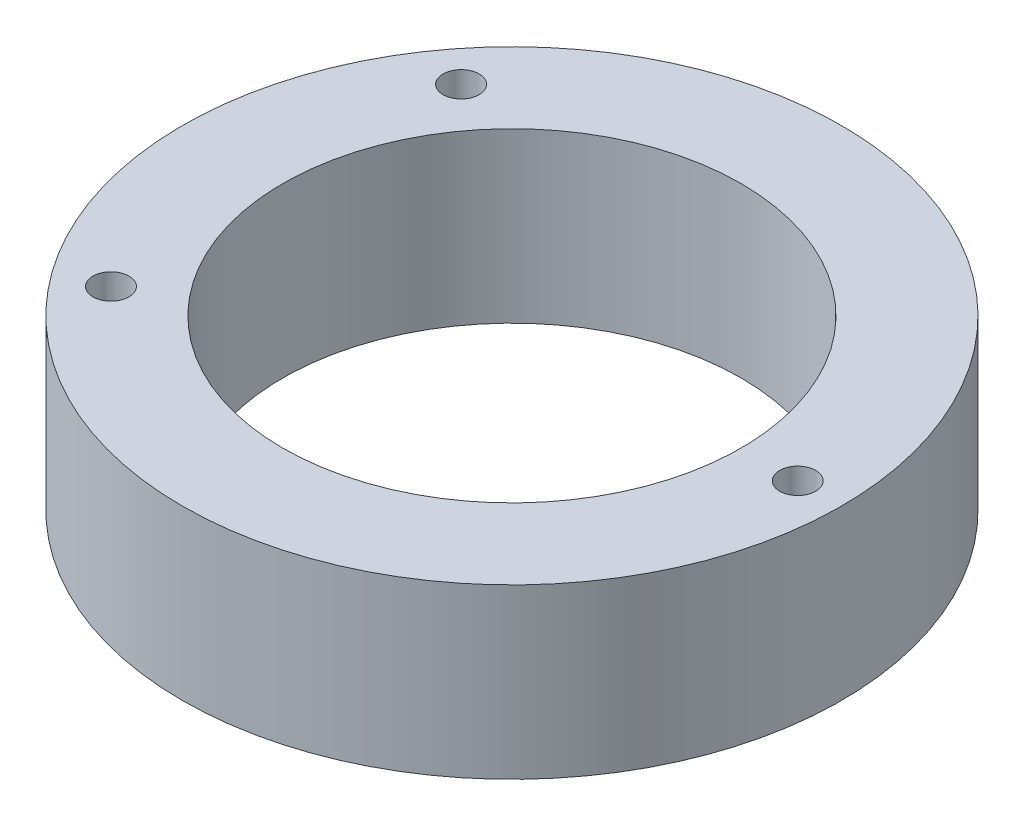
ISO-10303-21;
HEADER;
FILE_DESCRIPTION(('STEP AP214'),'2;1');
FILE_NAME('part.step','',(''),(''),'','','');
FILE_SCHEMA(('AUTOMOTIVE_DESIGN { 1 0 10303 214 1 1 1 1 }'));
ENDSEC;
DATA;
#1=APPLICATION_CONTEXT('core data for automotive mechanical design processes');
#2=APPLICATION_PROTOCOL_DEFINITION('international standard','automotive_design',2000,#1);
#3=PRODUCT_CONTEXT('',#1,'mechanical');
#4=PRODUCT('Part','Part','',(#3));
#5=PRODUCT_RELATED_PRODUCT_CATEGORY('part','',(#4));
#6=PRODUCT_DEFINITION_FORMATION('','',#4);
#7=PRODUCT_DEFINITION_CONTEXT('part definition',#1,'design');
#8=PRODUCT_DEFINITION('design','',#6,#7);
#9=PRODUCT_DEFINITION_SHAPE('','',#8);
#10=(LENGTH_UNIT() NAMED_UNIT(*) SI_UNIT(.MILLI.,.METRE.));
#11=(NAMED_UNIT(*) PLANE_ANGLE_UNIT() SI_UNIT($,.RADIAN.));
#12=(NAMED_UNIT(*) SI_UNIT($,.STERADIAN.) SOLID_ANGLE_UNIT());
#13=UNCERTAINTY_MEASURE_WITH_UNIT(LENGTH_MEASURE(1.E-05),#10,'distance_accuracy_value','');
#14=(GEOMETRIC_REPRESENTATION_CONTEXT(3) GLOBAL_UNCERTAINTY_ASSIGNED_CONTEXT((#13)) GLOBAL_UNIT_ASSIGNED_CONTEXT((#10,
#11,#12)) REPRESENTATION_CONTEXT('',''));
#15=CARTESIAN_POINT('',(0.,0.,0.));
#16=DIRECTION('',(0.,0.,1.));
#17=DIRECTION('',(1.,0.,0.));
#18=AXIS2_PLACEMENT_3D('',#15,#16,#17);
#19=CARTESIAN_POINT('',(0.,16.35,0.));
#20=DIRECTION('',(0.,1.,0.));
#21=DIRECTION('',(0.,0.,1.));
#22=AXIS2_PLACEMENT_3D('',#19,#20,#21);
#23=PLANE('',#22);
#24=CARTESIAN_POINT('',(-21.9327372290304,16.35,-17.0005158051838));
#25=DIRECTION('',(0.,1.,0.));
#26=DIRECTION('',(0.,0.,1.));
#27=AXIS2_PLACEMENT_3D('',#24,#25,#26);
#28=CIRCLE('',#27,1.75);
#29=CARTESIAN_POINT('',(-21.9327372290304,16.35,-15.2505158051838));
#30=VERTEX_POINT('',#29);
#31=EDGE_CURVE('E55',#30,#30,#28,.T.);
#32=ORIENTED_EDGE('',*,*,#31,.F.);
#33=EDGE_LOOP('',(#32));
#34=FACE_BOUND('',#33,.T.);
#35=CARTESIAN_POINT('',(0.,16.35,0.));
#36=DIRECTION('',(0.,1.,0.));
#37=DIRECTION('',(0.,0.,1.));
#38=AXIS2_PLACEMENT_3D('',#35,#36,#37);
#39=CIRCLE('',#38,22.25);
#40=CARTESIAN_POINT('',(0.,16.35,22.25));
#41=VERTEX_POINT('',#40);
#42=EDGE_CURVE('E44',#41,#41,#39,.T.);
#43=ORIENTED_EDGE('',*,*,#42,.F.);
#44=EDGE_LOOP('',(#43));
#45=FACE_BOUND('',#44,.T.);
#46=CARTESIAN_POINT('',(0.,16.35,0.));
#47=DIRECTION('',(0.,1.,0.));
#48=DIRECTION('',(0.,0.,1.));
#49=AXIS2_PLACEMENT_3D('',#46,#47,#48);
#50=CIRCLE('',#49,32.);
#51=CARTESIAN_POINT('',(0.,16.35,32.));
#52=VERTEX_POINT('',#51);
#53=EDGE_CURVE('E10',#52,#52,#50,.T.);
#54=ORIENTED_EDGE('',*,*,#53,.T.);
#55=EDGE_LOOP('',(#54));
#56=FACE_BOUND('',#55,.T.);
#57=CARTESIAN_POINT('',(27.75,16.35,0.));
#58=DIRECTION('',(0.,1.,0.));
#59=DIRECTION('',(0.,0.,1.));
#60=AXIS2_PLACEMENT_3D('',#57,#58,#59);
#61=CIRCLE('',#60,1.75);
#62=CARTESIAN_POINT('',(27.75,16.35,1.75));
#63=VERTEX_POINT('',#62);
#64=EDGE_CURVE('E49',#63,#63,#61,.T.);
#65=ORIENTED_EDGE('',*,*,#64,.F.);
#66=EDGE_LOOP('',(#65));
#67=FACE_BOUND('',#66,.T.);
#68=CARTESIAN_POINT('',(-21.9327372290304,16.35,17.0005158051838));
#69=DIRECTION('',(0.,1.,0.));
#70=DIRECTION('',(0.,0.,1.));
#71=AXIS2_PLACEMENT_3D('',#68,#69,#70);
#72=CIRCLE('',#71,1.75);
#73=CARTESIAN_POINT('',(-21.9327372290304,16.35,18.7505158051838));
#74=VERTEX_POINT('',#73);
#75=EDGE_CURVE('E61',#74,#74,#72,.T.);
#76=ORIENTED_EDGE('',*,*,#75,.F.);
#77=EDGE_LOOP('',(#76));
#78=FACE_BOUND('',#77,.T.);
#79=ADVANCED_FACE('F33',(#34,#45,#56,#67,#78),#23,.T.);
#80=CARTESIAN_POINT('',(0.,0.,0.));
#81=DIRECTION('',(0.,1.,0.));
#82=DIRECTION('',(0.,0.,1.));
#83=AXIS2_PLACEMENT_3D('',#80,#81,#82);
#84=PLANE('',#83);
#85=CARTESIAN_POINT('',(0.,0.,0.));
#86=DIRECTION('',(0.,1.,0.));
#87=DIRECTION('',(0.,0.,1.));
#88=AXIS2_PLACEMENT_3D('',#85,#86,#87);
#89=CIRCLE('',#88,32.);
#90=CARTESIAN_POINT('',(0.,0.,32.));
#91=VERTEX_POINT('',#90);
#92=EDGE_CURVE('E37',#91,#91,#89,.T.);
#93=ORIENTED_EDGE('',*,*,#92,.F.);
#94=EDGE_LOOP('',(#93));
#95=FACE_BOUND('',#94,.T.);
#96=CARTESIAN_POINT('',(0.,0.,0.));
#97=DIRECTION('',(0.,1.,0.));
#98=DIRECTION('',(0.,0.,1.));
#99=AXIS2_PLACEMENT_3D('',#96,#97,#98);
#100=CIRCLE('',#99,22.25);
#101=CARTESIAN_POINT('',(0.,0.,22.25));
#102=VERTEX_POINT('',#101);
#103=EDGE_CURVE('E46',#102,#102,#100,.T.);
#104=ORIENTED_EDGE('',*,*,#103,.T.);
#105=EDGE_LOOP('',(#104));
#106=FACE_BOUND('',#105,.T.);
#107=CARTESIAN_POINT('',(27.75,0.,0.));
#108=DIRECTION('',(0.,1.,0.));
#109=DIRECTION('',(0.,0.,1.));
#110=AXIS2_PLACEMENT_3D('',#107,#108,#109);
#111=CIRCLE('',#110,1.75);
#112=CARTESIAN_POINT('',(27.75,0.,1.75));
#113=VERTEX_POINT('',#112);
#114=EDGE_CURVE('E52',#113,#113,#111,.T.);
#115=ORIENTED_EDGE('',*,*,#114,.T.);
#116=EDGE_LOOP('',(#115));
#117=FACE_BOUND('',#116,.T.);
#118=CARTESIAN_POINT('',(-21.9327372290304,0.,-17.0005158051838));
#119=DIRECTION('',(0.,1.,0.));
#120=DIRECTION('',(0.,0.,1.));
#121=AXIS2_PLACEMENT_3D('',#118,#119,#120);
#122=CIRCLE('',#121,1.75);
#123=CARTESIAN_POINT('',(-21.9327372290304,0.,-15.2505158051838));
#124=VERTEX_POINT('',#123);
#125=EDGE_CURVE('E58',#124,#124,#122,.T.);
#126=ORIENTED_EDGE('',*,*,#125,.T.);
#127=EDGE_LOOP('',(#126));
#128=FACE_BOUND('',#127,.T.);
#129=CARTESIAN_POINT('',(-21.9327372290304,0.,17.0005158051838));
#130=DIRECTION('',(0.,1.,0.));
#131=DIRECTION('',(0.,0.,1.));
#132=AXIS2_PLACEMENT_3D('',#129,#130,#131);
#133=CIRCLE('',#132,1.75);
#134=CARTESIAN_POINT('',(-21.9327372290304,0.,18.7505158051838));
#135=VERTEX_POINT('',#134);
#136=EDGE_CURVE('E64',#135,#135,#133,.T.);
#137=ORIENTED_EDGE('',*,*,#136,.T.);
#138=EDGE_LOOP('',(#137));
#139=FACE_BOUND('',#138,.T.);
#140=ADVANCED_FACE('F74',(#95,#106,#117,#128,#139),#84,.F.);
#141=CARTESIAN_POINT('',(0.,16.35,0.));
#142=DIRECTION('',(0.,-1.,0.));
#143=DIRECTION('',(0.,0.,-1.));
#144=AXIS2_PLACEMENT_3D('',#141,#142,#143);
#145=CYLINDRICAL_SURFACE('',#144,32.);
#146=ORIENTED_EDGE('',*,*,#53,.F.);
#147=EDGE_LOOP('',(#146));
#148=FACE_BOUND('',#147,.T.);
#149=ORIENTED_EDGE('',*,*,#92,.T.);
#150=EDGE_LOOP('',(#149));
#151=FACE_BOUND('',#150,.T.);
#152=ADVANCED_FACE('F35',(#148,#151),#145,.T.);
#153=CARTESIAN_POINT('',(0.,16.35,0.));
#154=DIRECTION('',(0.,-1.,0.));
#155=DIRECTION('',(0.,0.,-1.));
#156=AXIS2_PLACEMENT_3D('',#153,#154,#155);
#157=CYLINDRICAL_SURFACE('',#156,22.25);
#158=ORIENTED_EDGE('',*,*,#42,.T.);
#159=EDGE_LOOP('',(#158));
#160=FACE_BOUND('',#159,.T.);
#161=ORIENTED_EDGE('',*,*,#103,.F.);
#162=EDGE_LOOP('',(#161));
#163=FACE_BOUND('',#162,.T.);
#164=ADVANCED_FACE('F84',(#160,#163),#157,.F.);
#165=CARTESIAN_POINT('',(27.75,16.35,0.));
#166=DIRECTION('',(0.,-1.,0.));
#167=DIRECTION('',(0.,0.,-1.));
#168=AXIS2_PLACEMENT_3D('',#165,#166,#167);
#169=CYLINDRICAL_SURFACE('',#168,1.75);
#170=ORIENTED_EDGE('',*,*,#64,.T.);
#171=EDGE_LOOP('',(#170));
#172=FACE_BOUND('',#171,.T.);
#173=ORIENTED_EDGE('',*,*,#114,.F.);
#174=EDGE_LOOP('',(#173));
#175=FACE_BOUND('',#174,.T.);
#176=ADVANCED_FACE('F87',(#172,#175),#169,.F.);
#177=CARTESIAN_POINT('',(-21.9327372290304,16.35,-17.0005158051838));
#178=DIRECTION('',(0.,-1.,0.));
#179=DIRECTION('',(0.,0.,-1.));
#180=AXIS2_PLACEMENT_3D('',#177,#178,#179);
#181=CYLINDRICAL_SURFACE('',#180,1.75);
#182=ORIENTED_EDGE('',*,*,#31,.T.);
#183=EDGE_LOOP('',(#182));
#184=FACE_BOUND('',#183,.T.);
#185=ORIENTED_EDGE('',*,*,#125,.F.);
#186=EDGE_LOOP('',(#185));
#187=FACE_BOUND('',#186,.T.);
#188=ADVANCED_FACE('F91',(#184,#187),#181,.F.);
#189=CARTESIAN_POINT('',(-21.9327372290304,16.35,17.0005158051838));
#190=DIRECTION('',(0.,-1.,0.));
#191=DIRECTION('',(0.,0.,-1.));
#192=AXIS2_PLACEMENT_3D('',#189,#190,#191);
#193=CYLINDRICAL_SURFACE('',#192,1.75);
#194=ORIENTED_EDGE('',*,*,#75,.T.);
#195=EDGE_LOOP('',(#194));
#196=FACE_BOUND('',#195,.T.);
#197=ORIENTED_EDGE('',*,*,#136,.F.);
#198=EDGE_LOOP('',(#197));
#199=FACE_BOUND('',#198,.T.);
#200=ADVANCED_FACE('F70',(#196,#199),#193,.F.);
#201=CLOSED_SHELL('',(#79,#140,#152,#164,#176,#188,#200));
#202=MANIFOLD_SOLID_BREP('B2',#201);
#203=ADVANCED_BREP_SHAPE_REPRESENTATION('',(#18,#202),#14);
#204=SHAPE_DEFINITION_REPRESENTATION(#9,#203);
ENDSEC;
END-ISO-10303-21;
